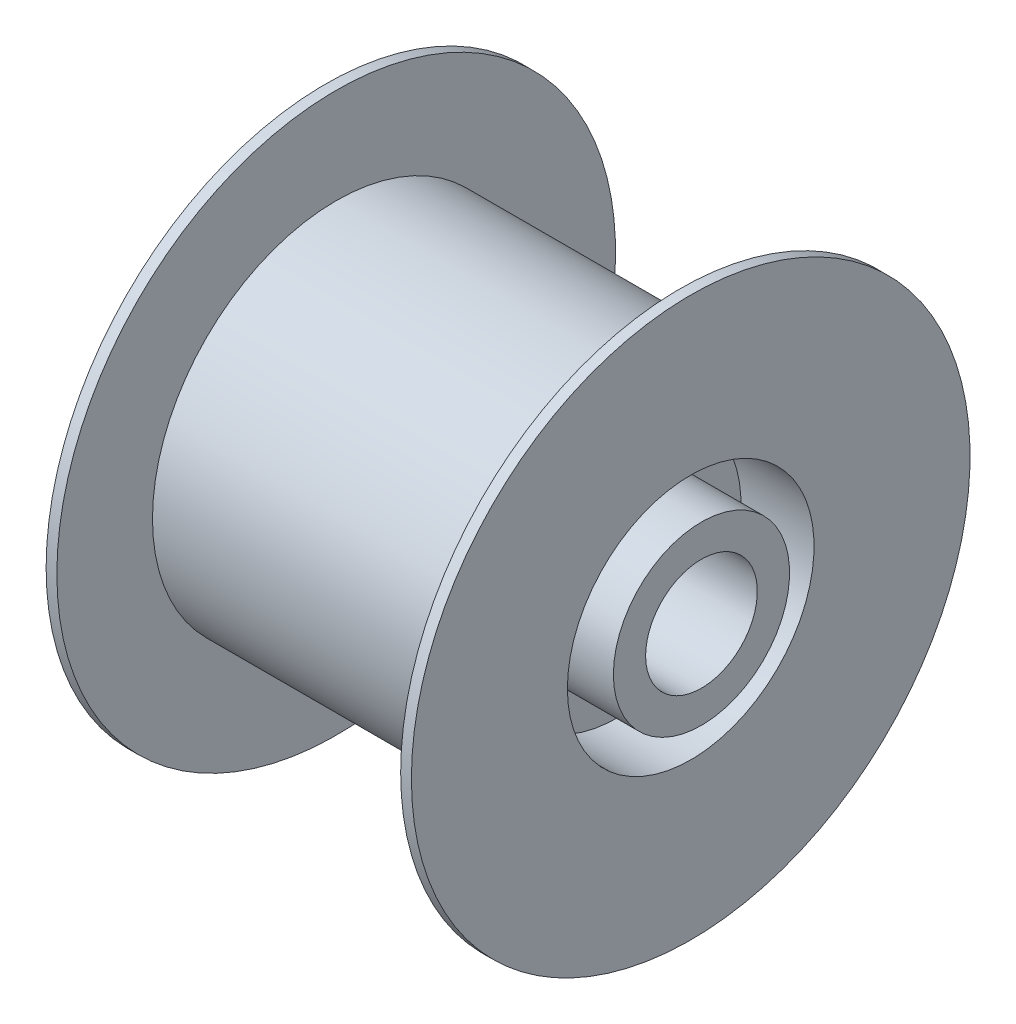
ISO-10303-21;
HEADER;
FILE_DESCRIPTION(('STEP AP214'),'2;1');
FILE_NAME('part.step','',(''),(''),'','','');
FILE_SCHEMA(('AUTOMOTIVE_DESIGN { 1 0 10303 214 1 1 1 1 }'));
ENDSEC;
DATA;
#1=APPLICATION_CONTEXT('core data for automotive mechanical design processes');
#2=APPLICATION_PROTOCOL_DEFINITION('international standard','automotive_design',2000,#1);
#3=PRODUCT_CONTEXT('',#1,'mechanical');
#4=PRODUCT('Part','Part','',(#3));
#5=PRODUCT_RELATED_PRODUCT_CATEGORY('part','',(#4));
#6=PRODUCT_DEFINITION_FORMATION('','',#4);
#7=PRODUCT_DEFINITION_CONTEXT('part definition',#1,'design');
#8=PRODUCT_DEFINITION('design','',#6,#7);
#9=PRODUCT_DEFINITION_SHAPE('','',#8);
#10=(LENGTH_UNIT() NAMED_UNIT(*) SI_UNIT(.MILLI.,.METRE.));
#11=(NAMED_UNIT(*) PLANE_ANGLE_UNIT() SI_UNIT($,.RADIAN.));
#12=(NAMED_UNIT(*) SI_UNIT($,.STERADIAN.) SOLID_ANGLE_UNIT());
#13=UNCERTAINTY_MEASURE_WITH_UNIT(LENGTH_MEASURE(1.E-05),#10,'distance_accuracy_value','');
#14=(GEOMETRIC_REPRESENTATION_CONTEXT(3) GLOBAL_UNCERTAINTY_ASSIGNED_CONTEXT((#13)) GLOBAL_UNIT_ASSIGNED_CONTEXT((#10,
#11,#12)) REPRESENTATION_CONTEXT('',''));
#15=CARTESIAN_POINT('',(0.,0.,0.));
#16=DIRECTION('',(0.,0.,1.));
#17=DIRECTION('',(1.,0.,0.));
#18=AXIS2_PLACEMENT_3D('',#15,#16,#17);
#19=CARTESIAN_POINT('',(0.,0.,0.));
#20=DIRECTION('',(-1.,0.,0.));
#21=DIRECTION('',(0.,0.,1.));
#22=AXIS2_PLACEMENT_3D('',#19,#20,#21);
#23=CYLINDRICAL_SURFACE('',#22,4.1);
#24=CARTESIAN_POINT('',(0.,0.,0.));
#25=DIRECTION('',(-1.,0.,0.));
#26=DIRECTION('',(0.,0.,1.));
#27=AXIS2_PLACEMENT_3D('',#24,#25,#26);
#28=CIRCLE('',#27,4.1);
#29=CARTESIAN_POINT('',(0.,0.,4.1));
#30=VERTEX_POINT('',#29);
#31=EDGE_CURVE('E10',#30,#30,#28,.T.);
#32=ORIENTED_EDGE('',*,*,#31,.F.);
#33=EDGE_LOOP('',(#32));
#34=FACE_BOUND('',#33,.T.);
#35=CARTESIAN_POINT('',(3.9,0.,0.));
#36=DIRECTION('',(-1.,0.,0.));
#37=DIRECTION('',(0.,0.,1.));
#38=AXIS2_PLACEMENT_3D('',#35,#36,#37);
#39=CIRCLE('',#38,4.1);
#40=CARTESIAN_POINT('',(3.9,0.,4.1));
#41=VERTEX_POINT('',#40);
#42=EDGE_CURVE('E106',#41,#41,#39,.T.);
#43=ORIENTED_EDGE('',*,*,#42,.T.);
#44=EDGE_LOOP('',(#43));
#45=FACE_BOUND('',#44,.T.);
#46=ADVANCED_FACE('F38',(#34,#45),#23,.T.);
#47=CARTESIAN_POINT('',(0.,4.1,0.));
#48=DIRECTION('',(1.,0.,0.));
#49=DIRECTION('',(0.,0.,-1.));
#50=AXIS2_PLACEMENT_3D('',#47,#48,#49);
#51=PLANE('',#50);
#52=CARTESIAN_POINT('',(0.,0.,0.));
#53=DIRECTION('',(-1.,0.,0.));
#54=DIRECTION('',(0.,0.,1.));
#55=AXIS2_PLACEMENT_3D('',#52,#53,#54);
#56=CIRCLE('',#55,2.6);
#57=CARTESIAN_POINT('',(0.,0.,2.6));
#58=VERTEX_POINT('',#57);
#59=EDGE_CURVE('E45',#58,#58,#56,.T.);
#60=ORIENTED_EDGE('',*,*,#59,.F.);
#61=EDGE_LOOP('',(#60));
#62=FACE_BOUND('',#61,.T.);
#63=ORIENTED_EDGE('',*,*,#31,.T.);
#64=EDGE_LOOP('',(#63));
#65=FACE_BOUND('',#64,.T.);
#66=ADVANCED_FACE('F191',(#62,#65),#51,.F.);
#67=CARTESIAN_POINT('',(0.,0.,0.));
#68=DIRECTION('',(-1.,0.,0.));
#69=DIRECTION('',(0.,0.,1.));
#70=AXIS2_PLACEMENT_3D('',#67,#68,#69);
#71=CYLINDRICAL_SURFACE('',#70,2.6);
#72=CARTESIAN_POINT('',(18.,0.,0.));
#73=DIRECTION('',(-1.,0.,0.));
#74=DIRECTION('',(0.,0.,1.));
#75=AXIS2_PLACEMENT_3D('',#72,#73,#74);
#76=CIRCLE('',#75,2.6);
#77=CARTESIAN_POINT('',(18.,0.,2.6));
#78=VERTEX_POINT('',#77);
#79=EDGE_CURVE('E52',#78,#78,#76,.T.);
#80=ORIENTED_EDGE('',*,*,#79,.F.);
#81=EDGE_LOOP('',(#80));
#82=FACE_BOUND('',#81,.T.);
#83=ORIENTED_EDGE('',*,*,#59,.T.);
#84=EDGE_LOOP('',(#83));
#85=FACE_BOUND('',#84,.T.);
#86=ADVANCED_FACE('F186',(#82,#85),#71,.F.);
#87=CARTESIAN_POINT('',(18.,2.6,0.));
#88=DIRECTION('',(-1.,0.,0.));
#89=DIRECTION('',(0.,0.,1.));
#90=AXIS2_PLACEMENT_3D('',#87,#88,#89);
#91=PLANE('',#90);
#92=CARTESIAN_POINT('',(18.,0.,0.));
#93=DIRECTION('',(-1.,0.,0.));
#94=DIRECTION('',(0.,0.,1.));
#95=AXIS2_PLACEMENT_3D('',#92,#93,#94);
#96=CIRCLE('',#95,4.1);
#97=CARTESIAN_POINT('',(18.,0.,4.1));
#98=VERTEX_POINT('',#97);
#99=EDGE_CURVE('E59',#98,#98,#96,.T.);
#100=ORIENTED_EDGE('',*,*,#99,.F.);
#101=EDGE_LOOP('',(#100));
#102=FACE_BOUND('',#101,.T.);
#103=ORIENTED_EDGE('',*,*,#79,.T.);
#104=EDGE_LOOP('',(#103));
#105=FACE_BOUND('',#104,.T.);
#106=ADVANCED_FACE('F180',(#102,#105),#91,.F.);
#107=CARTESIAN_POINT('',(0.,0.,0.));
#108=DIRECTION('',(-1.,0.,0.));
#109=DIRECTION('',(0.,0.,1.));
#110=AXIS2_PLACEMENT_3D('',#107,#108,#109);
#111=CYLINDRICAL_SURFACE('',#110,4.1);
#112=CARTESIAN_POINT('',(14.1,0.,0.));
#113=DIRECTION('',(-1.,0.,0.));
#114=DIRECTION('',(0.,0.,1.));
#115=AXIS2_PLACEMENT_3D('',#112,#113,#114);
#116=CIRCLE('',#115,4.1);
#117=CARTESIAN_POINT('',(14.1,0.,4.1));
#118=VERTEX_POINT('',#117);
#119=EDGE_CURVE('E65',#118,#118,#116,.T.);
#120=ORIENTED_EDGE('',*,*,#119,.F.);
#121=EDGE_LOOP('',(#120));
#122=FACE_BOUND('',#121,.T.);
#123=ORIENTED_EDGE('',*,*,#99,.T.);
#124=EDGE_LOOP('',(#123));
#125=FACE_BOUND('',#124,.T.);
#126=ADVANCED_FACE('F174',(#122,#125),#111,.T.);
#127=CARTESIAN_POINT('',(14.1,4.1,0.));
#128=DIRECTION('',(-1.,0.,0.));
#129=DIRECTION('',(0.,0.,1.));
#130=AXIS2_PLACEMENT_3D('',#127,#128,#129);
#131=PLANE('',#130);
#132=CARTESIAN_POINT('',(14.1,0.,0.));
#133=DIRECTION('',(-1.,0.,0.));
#134=DIRECTION('',(0.,0.,1.));
#135=AXIS2_PLACEMENT_3D('',#132,#133,#134);
#136=CIRCLE('',#135,5.74);
#137=CARTESIAN_POINT('',(14.1,0.,5.74));
#138=VERTEX_POINT('',#137);
#139=EDGE_CURVE('E69',#138,#138,#136,.T.);
#140=ORIENTED_EDGE('',*,*,#139,.F.);
#141=EDGE_LOOP('',(#140));
#142=FACE_BOUND('',#141,.T.);
#143=ORIENTED_EDGE('',*,*,#119,.T.);
#144=EDGE_LOOP('',(#143));
#145=FACE_BOUND('',#144,.T.);
#146=ADVANCED_FACE('F168',(#142,#145),#131,.F.);
#147=CARTESIAN_POINT('',(0.,0.,0.));
#148=DIRECTION('',(-1.,0.,0.));
#149=DIRECTION('',(0.,0.,1.));
#150=AXIS2_PLACEMENT_3D('',#147,#148,#149);
#151=CYLINDRICAL_SURFACE('',#150,5.74);
#152=CARTESIAN_POINT('',(17.5,0.,0.));
#153=DIRECTION('',(-1.,0.,0.));
#154=DIRECTION('',(0.,0.,1.));
#155=AXIS2_PLACEMENT_3D('',#152,#153,#154);
#156=CIRCLE('',#155,5.74);
#157=CARTESIAN_POINT('',(17.5,0.,5.74));
#158=VERTEX_POINT('',#157);
#159=EDGE_CURVE('E73',#158,#158,#156,.T.);
#160=ORIENTED_EDGE('',*,*,#159,.F.);
#161=EDGE_LOOP('',(#160));
#162=FACE_BOUND('',#161,.T.);
#163=ORIENTED_EDGE('',*,*,#139,.T.);
#164=EDGE_LOOP('',(#163));
#165=FACE_BOUND('',#164,.T.);
#166=ADVANCED_FACE('F162',(#162,#165),#151,.F.);
#167=CARTESIAN_POINT('',(17.5,13.,0.));
#168=DIRECTION('',(-1.,0.,0.));
#169=DIRECTION('',(0.,0.,1.));
#170=AXIS2_PLACEMENT_3D('',#167,#168,#169);
#171=PLANE('',#170);
#172=CARTESIAN_POINT('',(17.5,0.,0.));
#173=DIRECTION('',(-1.,0.,0.));
#174=DIRECTION('',(0.,0.,1.));
#175=AXIS2_PLACEMENT_3D('',#172,#173,#174);
#176=CIRCLE('',#175,13.);
#177=CARTESIAN_POINT('',(17.5,0.,13.));
#178=VERTEX_POINT('',#177);
#179=EDGE_CURVE('E77',#178,#178,#176,.T.);
#180=ORIENTED_EDGE('',*,*,#179,.F.);
#181=EDGE_LOOP('',(#180));
#182=FACE_BOUND('',#181,.T.);
#183=ORIENTED_EDGE('',*,*,#159,.T.);
#184=EDGE_LOOP('',(#183));
#185=FACE_BOUND('',#184,.T.);
#186=ADVANCED_FACE('F156',(#182,#185),#171,.F.);
#187=CARTESIAN_POINT('',(0.,0.,0.));
#188=DIRECTION('',(-1.,0.,0.));
#189=DIRECTION('',(0.,0.,1.));
#190=AXIS2_PLACEMENT_3D('',#187,#188,#189);
#191=CYLINDRICAL_SURFACE('',#190,13.);
#192=CARTESIAN_POINT('',(17.,0.,0.));
#193=DIRECTION('',(-1.,0.,0.));
#194=DIRECTION('',(0.,0.,1.));
#195=AXIS2_PLACEMENT_3D('',#192,#193,#194);
#196=CIRCLE('',#195,13.);
#197=CARTESIAN_POINT('',(17.,0.,13.));
#198=VERTEX_POINT('',#197);
#199=EDGE_CURVE('E81',#198,#198,#196,.T.);
#200=ORIENTED_EDGE('',*,*,#199,.F.);
#201=EDGE_LOOP('',(#200));
#202=FACE_BOUND('',#201,.T.);
#203=ORIENTED_EDGE('',*,*,#179,.T.);
#204=EDGE_LOOP('',(#203));
#205=FACE_BOUND('',#204,.T.);
#206=ADVANCED_FACE('F150',(#202,#205),#191,.T.);
#207=CARTESIAN_POINT('',(17.,8.55,0.));
#208=DIRECTION('',(1.,0.,0.));
#209=DIRECTION('',(0.,0.,-1.));
#210=AXIS2_PLACEMENT_3D('',#207,#208,#209);
#211=PLANE('',#210);
#212=CARTESIAN_POINT('',(17.,0.,0.));
#213=DIRECTION('',(-1.,0.,0.));
#214=DIRECTION('',(0.,0.,1.));
#215=AXIS2_PLACEMENT_3D('',#212,#213,#214);
#216=CIRCLE('',#215,8.55);
#217=CARTESIAN_POINT('',(17.,0.,8.55));
#218=VERTEX_POINT('',#217);
#219=EDGE_CURVE('E85',#218,#218,#216,.T.);
#220=ORIENTED_EDGE('',*,*,#219,.F.);
#221=EDGE_LOOP('',(#220));
#222=FACE_BOUND('',#221,.T.);
#223=ORIENTED_EDGE('',*,*,#199,.T.);
#224=EDGE_LOOP('',(#223));
#225=FACE_BOUND('',#224,.T.);
#226=ADVANCED_FACE('F144',(#222,#225),#211,.F.);
#227=CARTESIAN_POINT('',(0.,0.,0.));
#228=DIRECTION('',(-1.,0.,0.));
#229=DIRECTION('',(0.,0.,1.));
#230=AXIS2_PLACEMENT_3D('',#227,#228,#229);
#231=CYLINDRICAL_SURFACE('',#230,8.55);
#232=CARTESIAN_POINT('',(1.,0.,0.));
#233=DIRECTION('',(-1.,0.,0.));
#234=DIRECTION('',(0.,0.,1.));
#235=AXIS2_PLACEMENT_3D('',#232,#233,#234);
#236=CIRCLE('',#235,8.55);
#237=CARTESIAN_POINT('',(1.,0.,8.55));
#238=VERTEX_POINT('',#237);
#239=EDGE_CURVE('E89',#238,#238,#236,.T.);
#240=ORIENTED_EDGE('',*,*,#239,.F.);
#241=EDGE_LOOP('',(#240));
#242=FACE_BOUND('',#241,.T.);
#243=ORIENTED_EDGE('',*,*,#219,.T.);
#244=EDGE_LOOP('',(#243));
#245=FACE_BOUND('',#244,.T.);
#246=ADVANCED_FACE('F138',(#242,#245),#231,.T.);
#247=CARTESIAN_POINT('',(1.,13.,0.));
#248=DIRECTION('',(-1.,0.,0.));
#249=DIRECTION('',(0.,0.,1.));
#250=AXIS2_PLACEMENT_3D('',#247,#248,#249);
#251=PLANE('',#250);
#252=CARTESIAN_POINT('',(0.999999999999999,0.,0.));
#253=DIRECTION('',(-1.,0.,0.));
#254=DIRECTION('',(0.,0.,1.));
#255=AXIS2_PLACEMENT_3D('',#252,#253,#254);
#256=CIRCLE('',#255,13.);
#257=CARTESIAN_POINT('',(0.999999999999999,0.,13.));
#258=VERTEX_POINT('',#257);
#259=EDGE_CURVE('E93',#258,#258,#256,.T.);
#260=ORIENTED_EDGE('',*,*,#259,.F.);
#261=EDGE_LOOP('',(#260));
#262=FACE_BOUND('',#261,.T.);
#263=ORIENTED_EDGE('',*,*,#239,.T.);
#264=EDGE_LOOP('',(#263));
#265=FACE_BOUND('',#264,.T.);
#266=ADVANCED_FACE('F132',(#262,#265),#251,.F.);
#267=CARTESIAN_POINT('',(0.,0.,0.));
#268=DIRECTION('',(-1.,0.,0.));
#269=DIRECTION('',(0.,0.,1.));
#270=AXIS2_PLACEMENT_3D('',#267,#268,#269);
#271=CYLINDRICAL_SURFACE('',#270,13.);
#272=CARTESIAN_POINT('',(0.499999999999999,0.,0.));
#273=DIRECTION('',(-1.,0.,0.));
#274=DIRECTION('',(0.,0.,1.));
#275=AXIS2_PLACEMENT_3D('',#272,#273,#274);
#276=CIRCLE('',#275,13.);
#277=CARTESIAN_POINT('',(0.499999999999999,0.,13.));
#278=VERTEX_POINT('',#277);
#279=EDGE_CURVE('E96',#278,#278,#276,.T.);
#280=ORIENTED_EDGE('',*,*,#279,.F.);
#281=EDGE_LOOP('',(#280));
#282=FACE_BOUND('',#281,.T.);
#283=ORIENTED_EDGE('',*,*,#259,.T.);
#284=EDGE_LOOP('',(#283));
#285=FACE_BOUND('',#284,.T.);
#286=ADVANCED_FACE('F126',(#282,#285),#271,.T.);
#287=CARTESIAN_POINT('',(0.499999999999999,5.74,0.));
#288=DIRECTION('',(1.,0.,0.));
#289=DIRECTION('',(0.,0.,-1.));
#290=AXIS2_PLACEMENT_3D('',#287,#288,#289);
#291=PLANE('',#290);
#292=CARTESIAN_POINT('',(0.499999999999999,0.,0.));
#293=DIRECTION('',(-1.,0.,0.));
#294=DIRECTION('',(0.,0.,1.));
#295=AXIS2_PLACEMENT_3D('',#292,#293,#294);
#296=CIRCLE('',#295,5.74);
#297=CARTESIAN_POINT('',(0.499999999999999,0.,5.74));
#298=VERTEX_POINT('',#297);
#299=EDGE_CURVE('E100',#298,#298,#296,.T.);
#300=ORIENTED_EDGE('',*,*,#299,.F.);
#301=EDGE_LOOP('',(#300));
#302=FACE_BOUND('',#301,.T.);
#303=ORIENTED_EDGE('',*,*,#279,.T.);
#304=EDGE_LOOP('',(#303));
#305=FACE_BOUND('',#304,.T.);
#306=ADVANCED_FACE('F120',(#302,#305),#291,.F.);
#307=CARTESIAN_POINT('',(0.,0.,0.));
#308=DIRECTION('',(-1.,0.,0.));
#309=DIRECTION('',(0.,0.,1.));
#310=AXIS2_PLACEMENT_3D('',#307,#308,#309);
#311=CYLINDRICAL_SURFACE('',#310,5.74);
#312=CARTESIAN_POINT('',(3.9,0.,0.));
#313=DIRECTION('',(-1.,0.,0.));
#314=DIRECTION('',(0.,0.,1.));
#315=AXIS2_PLACEMENT_3D('',#312,#313,#314);
#316=CIRCLE('',#315,5.74);
#317=CARTESIAN_POINT('',(3.9,0.,5.74));
#318=VERTEX_POINT('',#317);
#319=EDGE_CURVE('E103',#318,#318,#316,.T.);
#320=ORIENTED_EDGE('',*,*,#319,.F.);
#321=EDGE_LOOP('',(#320));
#322=FACE_BOUND('',#321,.T.);
#323=ORIENTED_EDGE('',*,*,#299,.T.);
#324=EDGE_LOOP('',(#323));
#325=FACE_BOUND('',#324,.T.);
#326=ADVANCED_FACE('F114',(#322,#325),#311,.F.);
#327=CARTESIAN_POINT('',(3.9,4.1,0.));
#328=DIRECTION('',(1.,0.,0.));
#329=DIRECTION('',(0.,0.,-1.));
#330=AXIS2_PLACEMENT_3D('',#327,#328,#329);
#331=PLANE('',#330);
#332=ORIENTED_EDGE('',*,*,#42,.F.);
#333=EDGE_LOOP('',(#332));
#334=FACE_BOUND('',#333,.T.);
#335=ORIENTED_EDGE('',*,*,#319,.T.);
#336=EDGE_LOOP('',(#335));
#337=FACE_BOUND('',#336,.T.);
#338=ADVANCED_FACE('F111',(#334,#337),#331,.F.);
#339=CLOSED_SHELL('',(#46,#66,#86,#106,#126,#146,#166,#186,#206,#226,#246,#266,#286,#306,#326,#338));
#340=MANIFOLD_SOLID_BREP('B2',#339);
#341=ADVANCED_BREP_SHAPE_REPRESENTATION('',(#18,#340),#14);
#342=SHAPE_DEFINITION_REPRESENTATION(#9,#341);
ENDSEC;
END-ISO-10303-21;
